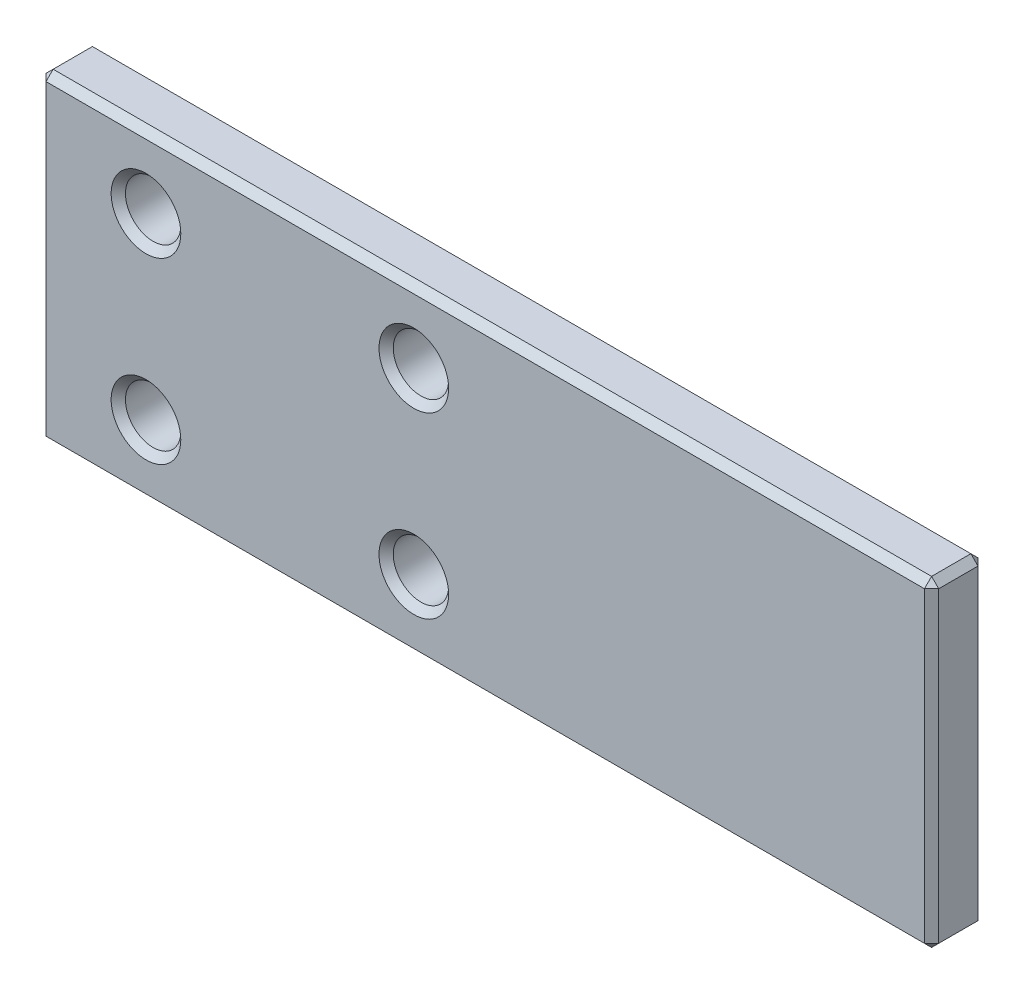
ISO-10303-21;
HEADER;
FILE_DESCRIPTION(('STEP AP214'),'2;1');
FILE_NAME('part.step','',(''),(''),'','','');
FILE_SCHEMA(('AUTOMOTIVE_DESIGN { 1 0 10303 214 1 1 1 1 }'));
ENDSEC;
DATA;
#1=APPLICATION_CONTEXT('core data for automotive mechanical design processes');
#2=APPLICATION_PROTOCOL_DEFINITION('international standard','automotive_design',2000,#1);
#3=PRODUCT_CONTEXT('',#1,'mechanical');
#4=PRODUCT('Part','Part','',(#3));
#5=PRODUCT_RELATED_PRODUCT_CATEGORY('part','',(#4));
#6=PRODUCT_DEFINITION_FORMATION('','',#4);
#7=PRODUCT_DEFINITION_CONTEXT('part definition',#1,'design');
#8=PRODUCT_DEFINITION('design','',#6,#7);
#9=PRODUCT_DEFINITION_SHAPE('','',#8);
#10=(LENGTH_UNIT() NAMED_UNIT(*) SI_UNIT(.MILLI.,.METRE.));
#11=(NAMED_UNIT(*) PLANE_ANGLE_UNIT() SI_UNIT($,.RADIAN.));
#12=(NAMED_UNIT(*) SI_UNIT($,.STERADIAN.) SOLID_ANGLE_UNIT());
#13=UNCERTAINTY_MEASURE_WITH_UNIT(LENGTH_MEASURE(1.E-05),#10,'distance_accuracy_value','');
#14=(GEOMETRIC_REPRESENTATION_CONTEXT(3) GLOBAL_UNCERTAINTY_ASSIGNED_CONTEXT((#13)) GLOBAL_UNIT_ASSIGNED_CONTEXT((#10,
#11,#12)) REPRESENTATION_CONTEXT('',''));
#15=CARTESIAN_POINT('',(0.,0.,0.));
#16=DIRECTION('',(0.,0.,1.));
#17=DIRECTION('',(1.,0.,0.));
#18=AXIS2_PLACEMENT_3D('',#15,#16,#17);
#19=CARTESIAN_POINT('',(-15.3774556196048,8.44067796610169,3.));
#20=DIRECTION('',(1.,0.,0.));
#21=DIRECTION('',(0.,0.,-1.));
#22=AXIS2_PLACEMENT_3D('',#19,#20,#21);
#23=PLANE('',#22);
#24=DIRECTION('',(0.,1.,0.));
#25=VECTOR('',#24,1.);
#26=CARTESIAN_POINT('',(-15.3774556196048,8.44067796610169,2.6));
#27=LINE('',#26,#25);
#28=CARTESIAN_POINT('',(-15.3774556196048,-9.1593220338983,2.6));
#29=VERTEX_POINT('',#28);
#30=CARTESIAN_POINT('',(-15.3774556196048,8.0406779661017,2.6));
#31=VERTEX_POINT('',#30);
#32=EDGE_CURVE('E153',#29,#31,#27,.T.);
#33=ORIENTED_EDGE('',*,*,#32,.T.);
#34=DIRECTION('',(0.,0.,-1.));
#35=VECTOR('',#34,1.);
#36=CARTESIAN_POINT('',(-15.3774556196048,8.0406779661017,3.));
#37=LINE('',#36,#35);
#38=CARTESIAN_POINT('',(-15.3774556196048,8.0406779661017,0.399999999999998));
#39=VERTEX_POINT('',#38);
#40=EDGE_CURVE('E235',#31,#39,#37,.T.);
#41=ORIENTED_EDGE('',*,*,#40,.T.);
#42=DIRECTION('',(0.,-1.,0.));
#43=VECTOR('',#42,1.);
#44=CARTESIAN_POINT('',(-15.3774556196048,8.44067796610169,0.399999999999998));
#45=LINE('',#44,#43);
#46=CARTESIAN_POINT('',(-15.3774556196048,-9.1593220338983,0.399999999999998));
#47=VERTEX_POINT('',#46);
#48=EDGE_CURVE('E232',#39,#47,#45,.T.);
#49=ORIENTED_EDGE('',*,*,#48,.T.);
#50=DIRECTION('',(0.,0.,1.));
#51=VECTOR('',#50,1.);
#52=CARTESIAN_POINT('',(-15.3774556196048,-9.1593220338983,3.));
#53=LINE('',#52,#51);
#54=EDGE_CURVE('E229',#47,#29,#53,.T.);
#55=ORIENTED_EDGE('',*,*,#54,.T.);
#56=EDGE_LOOP('',(#33,#41,#49,#55));
#57=FACE_BOUND('',#56,.T.);
#58=ADVANCED_FACE('F39',(#57),#23,.F.);
#59=CARTESIAN_POINT('',(-15.3774556196048,-9.5593220338983,3.));
#60=DIRECTION('',(0.,1.,0.));
#61=DIRECTION('',(-1.,0.,0.));
#62=AXIS2_PLACEMENT_3D('',#59,#60,#61);
#63=PLANE('',#62);
#64=DIRECTION('',(0.,0.,-1.));
#65=VECTOR('',#64,1.);
#66=CARTESIAN_POINT('',(-14.9774556196048,-9.5593220338983,3.));
#67=LINE('',#66,#65);
#68=CARTESIAN_POINT('',(-14.9774556196048,-9.5593220338983,2.6));
#69=VERTEX_POINT('',#68);
#70=CARTESIAN_POINT('',(-14.9774556196048,-9.5593220338983,0.399999999999998));
#71=VERTEX_POINT('',#70);
#72=EDGE_CURVE('E237',#69,#71,#67,.T.);
#73=ORIENTED_EDGE('',*,*,#72,.T.);
#74=DIRECTION('',(1.,0.,0.));
#75=VECTOR('',#74,1.);
#76=CARTESIAN_POINT('',(-15.3774556196048,-9.5593220338983,0.399999999999998));
#77=LINE('',#76,#75);
#78=CARTESIAN_POINT('',(34.2225443803952,-9.5593220338983,0.399999999999998));
#79=VERTEX_POINT('',#78);
#80=EDGE_CURVE('E243',#71,#79,#77,.T.);
#81=ORIENTED_EDGE('',*,*,#80,.T.);
#82=DIRECTION('',(0.,0.,1.));
#83=VECTOR('',#82,1.);
#84=CARTESIAN_POINT('',(34.2225443803952,-9.5593220338983,3.));
#85=LINE('',#84,#83);
#86=CARTESIAN_POINT('',(34.2225443803952,-9.5593220338983,2.6));
#87=VERTEX_POINT('',#86);
#88=EDGE_CURVE('E241',#79,#87,#85,.T.);
#89=ORIENTED_EDGE('',*,*,#88,.T.);
#90=DIRECTION('',(-1.,0.,0.));
#91=VECTOR('',#90,1.);
#92=CARTESIAN_POINT('',(-15.3774556196048,-9.5593220338983,2.6));
#93=LINE('',#92,#91);
#94=EDGE_CURVE('E239',#87,#69,#93,.T.);
#95=ORIENTED_EDGE('',*,*,#94,.T.);
#96=EDGE_LOOP('',(#73,#81,#89,#95));
#97=FACE_BOUND('',#96,.T.);
#98=ADVANCED_FACE('F343',(#97),#63,.F.);
#99=CARTESIAN_POINT('',(34.6225443803952,8.44067796610169,3.));
#100=DIRECTION('',(-1.,0.,0.));
#101=DIRECTION('',(0.,0.,1.));
#102=AXIS2_PLACEMENT_3D('',#99,#100,#101);
#103=PLANE('',#102);
#104=DIRECTION('',(0.,0.,-1.));
#105=VECTOR('',#104,1.);
#106=CARTESIAN_POINT('',(34.6225443803952,-9.1593220338983,3.));
#107=LINE('',#106,#105);
#108=CARTESIAN_POINT('',(34.6225443803952,-9.1593220338983,2.6));
#109=VERTEX_POINT('',#108);
#110=CARTESIAN_POINT('',(34.6225443803952,-9.1593220338983,0.399999999999998));
#111=VERTEX_POINT('',#110);
#112=EDGE_CURVE('E246',#109,#111,#107,.T.);
#113=ORIENTED_EDGE('',*,*,#112,.T.);
#114=DIRECTION('',(0.,1.,0.));
#115=VECTOR('',#114,1.);
#116=CARTESIAN_POINT('',(34.6225443803952,8.44067796610169,0.399999999999998));
#117=LINE('',#116,#115);
#118=CARTESIAN_POINT('',(34.6225443803952,8.0406779661017,0.399999999999998));
#119=VERTEX_POINT('',#118);
#120=EDGE_CURVE('E252',#111,#119,#117,.T.);
#121=ORIENTED_EDGE('',*,*,#120,.T.);
#122=DIRECTION('',(0.,0.,1.));
#123=VECTOR('',#122,1.);
#124=CARTESIAN_POINT('',(34.6225443803952,8.0406779661017,3.));
#125=LINE('',#124,#123);
#126=CARTESIAN_POINT('',(34.6225443803952,8.0406779661017,2.6));
#127=VERTEX_POINT('',#126);
#128=EDGE_CURVE('E250',#119,#127,#125,.T.);
#129=ORIENTED_EDGE('',*,*,#128,.T.);
#130=DIRECTION('',(0.,-1.,0.));
#131=VECTOR('',#130,1.);
#132=CARTESIAN_POINT('',(34.6225443803952,-9.5593220338983,2.6));
#133=LINE('',#132,#131);
#134=EDGE_CURVE('E248',#127,#109,#133,.T.);
#135=ORIENTED_EDGE('',*,*,#134,.T.);
#136=EDGE_LOOP('',(#113,#121,#129,#135));
#137=FACE_BOUND('',#136,.T.);
#138=ADVANCED_FACE('F372',(#137),#103,.F.);
#139=CARTESIAN_POINT('',(-15.3774556196048,8.44067796610169,3.));
#140=DIRECTION('',(0.,-1.,0.));
#141=DIRECTION('',(0.,0.,-1.));
#142=AXIS2_PLACEMENT_3D('',#139,#140,#141);
#143=PLANE('',#142);
#144=DIRECTION('',(0.,0.,-1.));
#145=VECTOR('',#144,1.);
#146=CARTESIAN_POINT('',(34.2225443803952,8.44067796610169,3.));
#147=LINE('',#146,#145);
#148=CARTESIAN_POINT('',(34.2225443803952,8.44067796610169,2.6));
#149=VERTEX_POINT('',#148);
#150=CARTESIAN_POINT('',(34.2225443803952,8.44067796610169,0.399999999999998));
#151=VERTEX_POINT('',#150);
#152=EDGE_CURVE('E255',#149,#151,#147,.T.);
#153=ORIENTED_EDGE('',*,*,#152,.T.);
#154=DIRECTION('',(-1.,0.,0.));
#155=VECTOR('',#154,1.);
#156=CARTESIAN_POINT('',(-15.3774556196048,8.44067796610169,0.399999999999998));
#157=LINE('',#156,#155);
#158=CARTESIAN_POINT('',(-14.9774556196048,8.44067796610169,0.399999999999998));
#159=VERTEX_POINT('',#158);
#160=EDGE_CURVE('E11',#151,#159,#157,.T.);
#161=ORIENTED_EDGE('',*,*,#160,.T.);
#162=DIRECTION('',(0.,0.,1.));
#163=VECTOR('',#162,1.);
#164=CARTESIAN_POINT('',(-14.9774556196048,8.44067796610169,3.));
#165=LINE('',#164,#163);
#166=CARTESIAN_POINT('',(-14.9774556196048,8.44067796610169,2.6));
#167=VERTEX_POINT('',#166);
#168=EDGE_CURVE('E49',#159,#167,#165,.T.);
#169=ORIENTED_EDGE('',*,*,#168,.T.);
#170=DIRECTION('',(1.,0.,0.));
#171=VECTOR('',#170,1.);
#172=CARTESIAN_POINT('',(34.6225443803952,8.44067796610169,2.6));
#173=LINE('',#172,#171);
#174=EDGE_CURVE('E257',#167,#149,#173,.T.);
#175=ORIENTED_EDGE('',*,*,#174,.T.);
#176=EDGE_LOOP('',(#153,#161,#169,#175));
#177=FACE_BOUND('',#176,.T.);
#178=ADVANCED_FACE('F325',(#177),#143,.F.);
#179=CARTESIAN_POINT('',(0.,0.,3.));
#180=DIRECTION('',(0.,0.,1.));
#181=DIRECTION('',(1.,0.,0.));
#182=AXIS2_PLACEMENT_3D('',#179,#180,#181);
#183=PLANE('',#182);
#184=CARTESIAN_POINT('',(-9.37745561960491,-5.55932203389831,3.));
#185=DIRECTION('',(0.,0.,1.));
#186=DIRECTION('',(1.,0.,0.));
#187=AXIS2_PLACEMENT_3D('',#184,#185,#186);
#188=CIRCLE('',#187,1.95000000000001);
#189=CARTESIAN_POINT('',(-7.42745561960489,-5.55932203389831,3.));
#190=VERTEX_POINT('',#189);
#191=EDGE_CURVE('E181',#190,#190,#188,.F.);
#192=ORIENTED_EDGE('',*,*,#191,.T.);
#193=EDGE_LOOP('',(#192));
#194=FACE_BOUND('',#193,.T.);
#195=CARTESIAN_POINT('',(5.62254438039509,-5.55932203389841,3.));
#196=DIRECTION('',(0.,0.,1.));
#197=DIRECTION('',(1.,0.,0.));
#198=AXIS2_PLACEMENT_3D('',#195,#196,#197);
#199=CIRCLE('',#198,1.95000000000001);
#200=CARTESIAN_POINT('',(7.57254438039511,-5.55932203389841,3.));
#201=VERTEX_POINT('',#200);
#202=EDGE_CURVE('E178',#201,#201,#199,.F.);
#203=ORIENTED_EDGE('',*,*,#202,.T.);
#204=EDGE_LOOP('',(#203));
#205=FACE_BOUND('',#204,.T.);
#206=CARTESIAN_POINT('',(5.6225443803952,4.44067796610159,3.));
#207=DIRECTION('',(0.,0.,1.));
#208=DIRECTION('',(1.,0.,0.));
#209=AXIS2_PLACEMENT_3D('',#206,#207,#208);
#210=CIRCLE('',#209,1.95000000000001);
#211=CARTESIAN_POINT('',(7.57254438039521,4.44067796610159,3.));
#212=VERTEX_POINT('',#211);
#213=EDGE_CURVE('E171',#212,#212,#210,.F.);
#214=ORIENTED_EDGE('',*,*,#213,.T.);
#215=EDGE_LOOP('',(#214));
#216=FACE_BOUND('',#215,.T.);
#217=CARTESIAN_POINT('',(-9.3774556196048,4.44067796610169,3.));
#218=DIRECTION('',(0.,0.,1.));
#219=DIRECTION('',(1.,0.,0.));
#220=AXIS2_PLACEMENT_3D('',#217,#218,#219);
#221=CIRCLE('',#220,1.95000000000001);
#222=CARTESIAN_POINT('',(-7.42745561960479,4.44067796610169,3.));
#223=VERTEX_POINT('',#222);
#224=EDGE_CURVE('E168',#223,#223,#221,.F.);
#225=ORIENTED_EDGE('',*,*,#224,.T.);
#226=EDGE_LOOP('',(#225));
#227=FACE_BOUND('',#226,.T.);
#228=DIRECTION('',(-1.,0.,0.));
#229=VECTOR('',#228,1.);
#230=CARTESIAN_POINT('',(-15.3774556196048,8.0406779661017,3.));
#231=LINE('',#230,#229);
#232=CARTESIAN_POINT('',(34.2225443803952,8.0406779661017,3.));
#233=VERTEX_POINT('',#232);
#234=CARTESIAN_POINT('',(-14.9774556196048,8.0406779661017,3.));
#235=VERTEX_POINT('',#234);
#236=EDGE_CURVE('E167',#233,#235,#231,.T.);
#237=ORIENTED_EDGE('',*,*,#236,.T.);
#238=DIRECTION('',(0.,-1.,0.));
#239=VECTOR('',#238,1.);
#240=CARTESIAN_POINT('',(-14.9774556196048,-9.5593220338983,3.));
#241=LINE('',#240,#239);
#242=CARTESIAN_POINT('',(-14.9774556196048,-9.15932203389831,3.));
#243=VERTEX_POINT('',#242);
#244=EDGE_CURVE('E151',#235,#243,#241,.T.);
#245=ORIENTED_EDGE('',*,*,#244,.T.);
#246=DIRECTION('',(1.,0.,0.));
#247=VECTOR('',#246,1.);
#248=CARTESIAN_POINT('',(34.6225443803952,-9.15932203389831,3.));
#249=LINE('',#248,#247);
#250=CARTESIAN_POINT('',(34.2225443803952,-9.15932203389831,3.));
#251=VERTEX_POINT('',#250);
#252=EDGE_CURVE('E157',#243,#251,#249,.T.);
#253=ORIENTED_EDGE('',*,*,#252,.T.);
#254=DIRECTION('',(0.,1.,0.));
#255=VECTOR('',#254,1.);
#256=CARTESIAN_POINT('',(34.2225443803952,8.44067796610169,3.));
#257=LINE('',#256,#255);
#258=EDGE_CURVE('E163',#251,#233,#257,.T.);
#259=ORIENTED_EDGE('',*,*,#258,.T.);
#260=EDGE_LOOP('',(#237,#245,#253,#259));
#261=FACE_BOUND('',#260,.T.);
#262=ADVANCED_FACE('F165',(#194,#205,#216,#227,#261),#183,.T.);
#263=CARTESIAN_POINT('',(0.,0.,0.));
#264=DIRECTION('',(0.,0.,1.));
#265=DIRECTION('',(1.,0.,0.));
#266=AXIS2_PLACEMENT_3D('',#263,#264,#265);
#267=PLANE('',#266);
#268=CARTESIAN_POINT('',(-9.37745561960491,-5.55932203389831,0.));
#269=DIRECTION('',(0.,0.,1.));
#270=DIRECTION('',(1.,0.,0.));
#271=AXIS2_PLACEMENT_3D('',#268,#269,#270);
#272=CIRCLE('',#271,1.94999999999999);
#273=CARTESIAN_POINT('',(-7.42745561960492,-5.55932203389831,0.));
#274=VERTEX_POINT('',#273);
#275=EDGE_CURVE('E208',#274,#274,#272,.T.);
#276=ORIENTED_EDGE('',*,*,#275,.T.);
#277=EDGE_LOOP('',(#276));
#278=FACE_BOUND('',#277,.T.);
#279=CARTESIAN_POINT('',(5.62254438039509,-5.55932203389841,0.));
#280=DIRECTION('',(0.,0.,1.));
#281=DIRECTION('',(1.,0.,0.));
#282=AXIS2_PLACEMENT_3D('',#279,#280,#281);
#283=CIRCLE('',#282,1.94999999999999);
#284=CARTESIAN_POINT('',(7.57254438039508,-5.55932203389841,0.));
#285=VERTEX_POINT('',#284);
#286=EDGE_CURVE('E205',#285,#285,#283,.T.);
#287=ORIENTED_EDGE('',*,*,#286,.T.);
#288=EDGE_LOOP('',(#287));
#289=FACE_BOUND('',#288,.T.);
#290=CARTESIAN_POINT('',(5.6225443803952,4.44067796610159,0.));
#291=DIRECTION('',(0.,0.,1.));
#292=DIRECTION('',(1.,0.,0.));
#293=AXIS2_PLACEMENT_3D('',#290,#291,#292);
#294=CIRCLE('',#293,1.94999999999999);
#295=CARTESIAN_POINT('',(7.57254438039518,4.44067796610159,0.));
#296=VERTEX_POINT('',#295);
#297=EDGE_CURVE('E202',#296,#296,#294,.T.);
#298=ORIENTED_EDGE('',*,*,#297,.T.);
#299=EDGE_LOOP('',(#298));
#300=FACE_BOUND('',#299,.T.);
#301=CARTESIAN_POINT('',(-9.3774556196048,4.44067796610169,0.));
#302=DIRECTION('',(0.,0.,1.));
#303=DIRECTION('',(1.,0.,0.));
#304=AXIS2_PLACEMENT_3D('',#301,#302,#303);
#305=CIRCLE('',#304,1.94999999999999);
#306=CARTESIAN_POINT('',(-7.42745561960482,4.44067796610169,0.));
#307=VERTEX_POINT('',#306);
#308=EDGE_CURVE('E199',#307,#307,#305,.T.);
#309=ORIENTED_EDGE('',*,*,#308,.T.);
#310=EDGE_LOOP('',(#309));
#311=FACE_BOUND('',#310,.T.);
#312=DIRECTION('',(-1.,0.,0.));
#313=VECTOR('',#312,1.);
#314=CARTESIAN_POINT('',(0.,-9.15932203389831,0.));
#315=LINE('',#314,#313);
#316=CARTESIAN_POINT('',(34.2225443803952,-9.15932203389831,0.));
#317=VERTEX_POINT('',#316);
#318=CARTESIAN_POINT('',(-14.9774556196048,-9.15932203389831,0.));
#319=VERTEX_POINT('',#318);
#320=EDGE_CURVE('E194',#317,#319,#315,.T.);
#321=ORIENTED_EDGE('',*,*,#320,.T.);
#322=DIRECTION('',(0.,1.,0.));
#323=VECTOR('',#322,1.);
#324=CARTESIAN_POINT('',(-14.9774556196048,0.,0.));
#325=LINE('',#324,#323);
#326=CARTESIAN_POINT('',(-14.9774556196048,8.0406779661017,0.));
#327=VERTEX_POINT('',#326);
#328=EDGE_CURVE('E196',#319,#327,#325,.T.);
#329=ORIENTED_EDGE('',*,*,#328,.T.);
#330=DIRECTION('',(1.,0.,0.));
#331=VECTOR('',#330,1.);
#332=CARTESIAN_POINT('',(0.,8.0406779661017,0.));
#333=LINE('',#332,#331);
#334=CARTESIAN_POINT('',(34.2225443803952,8.0406779661017,0.));
#335=VERTEX_POINT('',#334);
#336=EDGE_CURVE('E190',#327,#335,#333,.T.);
#337=ORIENTED_EDGE('',*,*,#336,.T.);
#338=DIRECTION('',(0.,-1.,0.));
#339=VECTOR('',#338,1.);
#340=CARTESIAN_POINT('',(34.2225443803952,0.,0.));
#341=LINE('',#340,#339);
#342=EDGE_CURVE('E192',#335,#317,#341,.T.);
#343=ORIENTED_EDGE('',*,*,#342,.T.);
#344=EDGE_LOOP('',(#321,#329,#337,#343));
#345=FACE_BOUND('',#344,.T.);
#346=ADVANCED_FACE('F786',(#278,#289,#300,#311,#345),#267,.F.);
#347=CARTESIAN_POINT('',(-9.3774556196048,4.44067796610169,3.));
#348=DIRECTION('',(0.,0.,-1.));
#349=DIRECTION('',(-1.,0.,0.));
#350=AXIS2_PLACEMENT_3D('',#347,#348,#349);
#351=CYLINDRICAL_SURFACE('',#350,1.55);
#352=CARTESIAN_POINT('',(-9.3774556196048,4.44067796610169,0.399999999999985));
#353=DIRECTION('',(0.,0.,1.));
#354=DIRECTION('',(1.,0.,0.));
#355=AXIS2_PLACEMENT_3D('',#352,#353,#354);
#356=CIRCLE('',#355,1.55);
#357=CARTESIAN_POINT('',(-7.8274556196048,4.44067796610169,0.399999999999985));
#358=VERTEX_POINT('',#357);
#359=EDGE_CURVE('E226',#358,#358,#356,.F.);
#360=ORIENTED_EDGE('',*,*,#359,.T.);
#361=EDGE_LOOP('',(#360));
#362=FACE_BOUND('',#361,.T.);
#363=CARTESIAN_POINT('',(-9.3774556196048,4.44067796610169,2.59999999999999));
#364=DIRECTION('',(0.,0.,1.));
#365=DIRECTION('',(1.,0.,0.));
#366=AXIS2_PLACEMENT_3D('',#363,#364,#365);
#367=CIRCLE('',#366,1.55);
#368=CARTESIAN_POINT('',(-7.8274556196048,4.44067796610169,2.59999999999999));
#369=VERTEX_POINT('',#368);
#370=EDGE_CURVE('E223',#369,#369,#367,.T.);
#371=ORIENTED_EDGE('',*,*,#370,.T.);
#372=EDGE_LOOP('',(#371));
#373=FACE_BOUND('',#372,.T.);
#374=ADVANCED_FACE('F775',(#362,#373),#351,.F.);
#375=CARTESIAN_POINT('',(5.6225443803952,4.44067796610159,3.));
#376=DIRECTION('',(0.,0.,-1.));
#377=DIRECTION('',(-1.,0.,0.));
#378=AXIS2_PLACEMENT_3D('',#375,#376,#377);
#379=CYLINDRICAL_SURFACE('',#378,1.55);
#380=CARTESIAN_POINT('',(5.6225443803952,4.44067796610159,2.59999999999999));
#381=DIRECTION('',(0.,0.,1.));
#382=DIRECTION('',(1.,0.,0.));
#383=AXIS2_PLACEMENT_3D('',#380,#381,#382);
#384=CIRCLE('',#383,1.55);
#385=CARTESIAN_POINT('',(7.1725443803952,4.44067796610159,2.59999999999999));
#386=VERTEX_POINT('',#385);
#387=EDGE_CURVE('E220',#386,#386,#384,.T.);
#388=ORIENTED_EDGE('',*,*,#387,.T.);
#389=EDGE_LOOP('',(#388));
#390=FACE_BOUND('',#389,.T.);
#391=CARTESIAN_POINT('',(5.6225443803952,4.44067796610159,0.399999999999985));
#392=DIRECTION('',(0.,0.,1.));
#393=DIRECTION('',(1.,0.,0.));
#394=AXIS2_PLACEMENT_3D('',#391,#392,#393);
#395=CIRCLE('',#394,1.55);
#396=CARTESIAN_POINT('',(7.1725443803952,4.44067796610159,0.399999999999985));
#397=VERTEX_POINT('',#396);
#398=EDGE_CURVE('E217',#397,#397,#395,.F.);
#399=ORIENTED_EDGE('',*,*,#398,.T.);
#400=EDGE_LOOP('',(#399));
#401=FACE_BOUND('',#400,.T.);
#402=ADVANCED_FACE('F764',(#390,#401),#379,.F.);
#403=CARTESIAN_POINT('',(5.62254438039509,-5.55932203389841,3.));
#404=DIRECTION('',(0.,0.,-1.));
#405=DIRECTION('',(-1.,0.,0.));
#406=AXIS2_PLACEMENT_3D('',#403,#404,#405);
#407=CYLINDRICAL_SURFACE('',#406,1.55);
#408=CARTESIAN_POINT('',(5.62254438039509,-5.55932203389841,2.59999999999999));
#409=DIRECTION('',(0.,0.,1.));
#410=DIRECTION('',(1.,0.,0.));
#411=AXIS2_PLACEMENT_3D('',#408,#409,#410);
#412=CIRCLE('',#411,1.55);
#413=CARTESIAN_POINT('',(7.17254438039509,-5.55932203389841,2.59999999999999));
#414=VERTEX_POINT('',#413);
#415=EDGE_CURVE('E214',#414,#414,#412,.T.);
#416=ORIENTED_EDGE('',*,*,#415,.T.);
#417=EDGE_LOOP('',(#416));
#418=FACE_BOUND('',#417,.T.);
#419=CARTESIAN_POINT('',(5.62254438039509,-5.55932203389841,0.399999999999985));
#420=DIRECTION('',(0.,0.,1.));
#421=DIRECTION('',(1.,0.,0.));
#422=AXIS2_PLACEMENT_3D('',#419,#420,#421);
#423=CIRCLE('',#422,1.55);
#424=CARTESIAN_POINT('',(7.17254438039509,-5.55932203389841,0.399999999999985));
#425=VERTEX_POINT('',#424);
#426=EDGE_CURVE('E211',#425,#425,#423,.F.);
#427=ORIENTED_EDGE('',*,*,#426,.T.);
#428=EDGE_LOOP('',(#427));
#429=FACE_BOUND('',#428,.T.);
#430=ADVANCED_FACE('F753',(#418,#429),#407,.F.);
#431=CARTESIAN_POINT('',(-9.37745561960491,-5.55932203389831,3.));
#432=DIRECTION('',(0.,0.,-1.));
#433=DIRECTION('',(-1.,0.,0.));
#434=AXIS2_PLACEMENT_3D('',#431,#432,#433);
#435=CYLINDRICAL_SURFACE('',#434,1.55);
#436=CARTESIAN_POINT('',(-9.37745561960491,-5.55932203389831,2.59999999999999));
#437=DIRECTION('',(0.,0.,1.));
#438=DIRECTION('',(1.,0.,0.));
#439=AXIS2_PLACEMENT_3D('',#436,#437,#438);
#440=CIRCLE('',#439,1.55);
#441=CARTESIAN_POINT('',(-7.82745561960491,-5.55932203389831,2.59999999999999));
#442=VERTEX_POINT('',#441);
#443=EDGE_CURVE('E187',#442,#442,#440,.T.);
#444=ORIENTED_EDGE('',*,*,#443,.T.);
#445=EDGE_LOOP('',(#444));
#446=FACE_BOUND('',#445,.T.);
#447=CARTESIAN_POINT('',(-9.37745561960491,-5.55932203389831,0.399999999999985));
#448=DIRECTION('',(0.,0.,1.));
#449=DIRECTION('',(1.,0.,0.));
#450=AXIS2_PLACEMENT_3D('',#447,#448,#449);
#451=CIRCLE('',#450,1.55);
#452=CARTESIAN_POINT('',(-7.82745561960491,-5.55932203389831,0.399999999999985));
#453=VERTEX_POINT('',#452);
#454=EDGE_CURVE('E184',#453,#453,#451,.F.);
#455=ORIENTED_EDGE('',*,*,#454,.T.);
#456=EDGE_LOOP('',(#455));
#457=FACE_BOUND('',#456,.T.);
#458=ADVANCED_FACE('F384',(#446,#457),#435,.F.);
#459=CARTESIAN_POINT('',(-9.37745561960491,-5.55932203389831,3.));
#460=DIRECTION('',(0.,0.,1.));
#461=DIRECTION('',(1.,0.,0.));
#462=AXIS2_PLACEMENT_3D('',#459,#460,#461);
#463=CONICAL_SURFACE('',#462,1.95000000000001,0.78539816339745);
#464=ORIENTED_EDGE('',*,*,#443,.F.);
#465=EDGE_LOOP('',(#464));
#466=FACE_BOUND('',#465,.T.);
#467=ORIENTED_EDGE('',*,*,#191,.F.);
#468=EDGE_LOOP('',(#467));
#469=FACE_BOUND('',#468,.T.);
#470=ADVANCED_FACE('F377',(#466,#469),#463,.F.);
#471=CARTESIAN_POINT('',(-9.37745561960491,-5.55932203389831,0.399999999999985));
#472=DIRECTION('',(0.,0.,-1.));
#473=DIRECTION('',(-1.,0.,0.));
#474=AXIS2_PLACEMENT_3D('',#471,#472,#473);
#475=CONICAL_SURFACE('',#474,1.55,0.78539816339745);
#476=ORIENTED_EDGE('',*,*,#275,.F.);
#477=EDGE_LOOP('',(#476));
#478=FACE_BOUND('',#477,.T.);
#479=ORIENTED_EDGE('',*,*,#454,.F.);
#480=EDGE_LOOP('',(#479));
#481=FACE_BOUND('',#480,.T.);
#482=ADVANCED_FACE('F383',(#478,#481),#475,.F.);
#483=CARTESIAN_POINT('',(5.62254438039509,-5.55932203389841,3.));
#484=DIRECTION('',(0.,0.,1.));
#485=DIRECTION('',(1.,0.,0.));
#486=AXIS2_PLACEMENT_3D('',#483,#484,#485);
#487=CONICAL_SURFACE('',#486,1.95000000000001,0.78539816339745);
#488=ORIENTED_EDGE('',*,*,#415,.F.);
#489=EDGE_LOOP('',(#488));
#490=FACE_BOUND('',#489,.T.);
#491=ORIENTED_EDGE('',*,*,#202,.F.);
#492=EDGE_LOOP('',(#491));
#493=FACE_BOUND('',#492,.T.);
#494=ADVANCED_FACE('F391',(#490,#493),#487,.F.);
#495=CARTESIAN_POINT('',(5.62254438039509,-5.55932203389841,0.399999999999985));
#496=DIRECTION('',(0.,0.,-1.));
#497=DIRECTION('',(-1.,0.,0.));
#498=AXIS2_PLACEMENT_3D('',#495,#496,#497);
#499=CONICAL_SURFACE('',#498,1.55,0.78539816339745);
#500=ORIENTED_EDGE('',*,*,#286,.F.);
#501=EDGE_LOOP('',(#500));
#502=FACE_BOUND('',#501,.T.);
#503=ORIENTED_EDGE('',*,*,#426,.F.);
#504=EDGE_LOOP('',(#503));
#505=FACE_BOUND('',#504,.T.);
#506=ADVANCED_FACE('F398',(#502,#505),#499,.F.);
#507=CARTESIAN_POINT('',(5.6225443803952,4.44067796610159,3.));
#508=DIRECTION('',(0.,0.,1.));
#509=DIRECTION('',(1.,0.,0.));
#510=AXIS2_PLACEMENT_3D('',#507,#508,#509);
#511=CONICAL_SURFACE('',#510,1.95000000000001,0.78539816339745);
#512=ORIENTED_EDGE('',*,*,#387,.F.);
#513=EDGE_LOOP('',(#512));
#514=FACE_BOUND('',#513,.T.);
#515=ORIENTED_EDGE('',*,*,#213,.F.);
#516=EDGE_LOOP('',(#515));
#517=FACE_BOUND('',#516,.T.);
#518=ADVANCED_FACE('F405',(#514,#517),#511,.F.);
#519=CARTESIAN_POINT('',(5.6225443803952,4.44067796610159,0.399999999999985));
#520=DIRECTION('',(0.,0.,-1.));
#521=DIRECTION('',(-1.,0.,0.));
#522=AXIS2_PLACEMENT_3D('',#519,#520,#521);
#523=CONICAL_SURFACE('',#522,1.55,0.78539816339745);
#524=ORIENTED_EDGE('',*,*,#297,.F.);
#525=EDGE_LOOP('',(#524));
#526=FACE_BOUND('',#525,.T.);
#527=ORIENTED_EDGE('',*,*,#398,.F.);
#528=EDGE_LOOP('',(#527));
#529=FACE_BOUND('',#528,.T.);
#530=ADVANCED_FACE('F412',(#526,#529),#523,.F.);
#531=CARTESIAN_POINT('',(-9.3774556196048,4.44067796610169,0.399999999999985));
#532=DIRECTION('',(0.,0.,-1.));
#533=DIRECTION('',(-1.,0.,0.));
#534=AXIS2_PLACEMENT_3D('',#531,#532,#533);
#535=CONICAL_SURFACE('',#534,1.55,0.78539816339745);
#536=ORIENTED_EDGE('',*,*,#308,.F.);
#537=EDGE_LOOP('',(#536));
#538=FACE_BOUND('',#537,.T.);
#539=ORIENTED_EDGE('',*,*,#359,.F.);
#540=EDGE_LOOP('',(#539));
#541=FACE_BOUND('',#540,.T.);
#542=ADVANCED_FACE('F419',(#538,#541),#535,.F.);
#543=CARTESIAN_POINT('',(-9.3774556196048,4.44067796610169,3.));
#544=DIRECTION('',(0.,0.,1.));
#545=DIRECTION('',(1.,0.,0.));
#546=AXIS2_PLACEMENT_3D('',#543,#544,#545);
#547=CONICAL_SURFACE('',#546,1.95000000000001,0.78539816339745);
#548=ORIENTED_EDGE('',*,*,#370,.F.);
#549=EDGE_LOOP('',(#548));
#550=FACE_BOUND('',#549,.T.);
#551=ORIENTED_EDGE('',*,*,#224,.F.);
#552=EDGE_LOOP('',(#551));
#553=FACE_BOUND('',#552,.T.);
#554=ADVANCED_FACE('F426',(#550,#553),#547,.F.);
#555=CARTESIAN_POINT('',(34.2225443803952,0.,3.));
#556=DIRECTION('',(0.707106781186548,0.,0.707106781186548));
#557=DIRECTION('',(0.,-1.,0.));
#558=AXIS2_PLACEMENT_3D('',#555,#556,#557);
#559=PLANE('',#558);
#560=DIRECTION('',(0.707106781186547,0.,-0.707106781186547));
#561=VECTOR('',#560,1.);
#562=CARTESIAN_POINT('',(34.4225443803952,8.0406779661017,2.8));
#563=LINE('',#562,#561);
#564=EDGE_CURVE('E44',#233,#127,#563,.T.);
#565=ORIENTED_EDGE('',*,*,#564,.F.);
#566=ORIENTED_EDGE('',*,*,#258,.F.);
#567=DIRECTION('',(-0.707106781186548,0.,0.707106781186548));
#568=VECTOR('',#567,1.);
#569=CARTESIAN_POINT('',(34.6225443803952,-9.1593220338983,2.6));
#570=LINE('',#569,#568);
#571=EDGE_CURVE('E306',#109,#251,#570,.T.);
#572=ORIENTED_EDGE('',*,*,#571,.F.);
#573=ORIENTED_EDGE('',*,*,#134,.F.);
#574=EDGE_LOOP('',(#565,#566,#572,#573));
#575=FACE_BOUND('',#574,.T.);
#576=ADVANCED_FACE('F42',(#575),#559,.T.);
#577=CARTESIAN_POINT('',(34.2225443803952,8.44067796610169,2.6));
#578=DIRECTION('',(0.577350269189626,0.577350269189626,0.577350269189626));
#579=DIRECTION('',(0.707106781186548,0.,-0.707106781186548));
#580=AXIS2_PLACEMENT_3D('',#577,#578,#579);
#581=PLANE('',#580);
#582=DIRECTION('',(0.,-0.707106781186547,0.707106781186547));
#583=VECTOR('',#582,1.);
#584=CARTESIAN_POINT('',(34.2225443803952,8.44067796610169,2.6));
#585=LINE('',#584,#583);
#586=EDGE_CURVE('E301',#233,#149,#585,.F.);
#587=ORIENTED_EDGE('',*,*,#586,.F.);
#588=ORIENTED_EDGE('',*,*,#564,.T.);
#589=DIRECTION('',(0.707106781186547,-0.707106781186547,0.));
#590=VECTOR('',#589,1.);
#591=CARTESIAN_POINT('',(34.2225443803952,8.44067796610169,2.6));
#592=LINE('',#591,#590);
#593=EDGE_CURVE('E304',#149,#127,#592,.T.);
#594=ORIENTED_EDGE('',*,*,#593,.F.);
#595=EDGE_LOOP('',(#587,#588,#594));
#596=FACE_BOUND('',#595,.T.);
#597=ADVANCED_FACE('F316',(#596),#581,.T.);
#598=CARTESIAN_POINT('',(34.6225443803952,-9.1593220338983,2.6));
#599=DIRECTION('',(0.577350269189629,-0.577350269189624,0.577350269189624));
#600=DIRECTION('',(0.707106781186544,0.,-0.70710678118655));
#601=AXIS2_PLACEMENT_3D('',#598,#599,#600);
#602=PLANE('',#601);
#603=DIRECTION('',(-0.707106781186544,-0.707106781186551,0.));
#604=VECTOR('',#603,1.);
#605=CARTESIAN_POINT('',(34.6225443803952,-9.1593220338983,2.6));
#606=LINE('',#605,#604);
#607=EDGE_CURVE('E297',#109,#87,#606,.T.);
#608=ORIENTED_EDGE('',*,*,#607,.F.);
#609=ORIENTED_EDGE('',*,*,#571,.T.);
#610=DIRECTION('',(0.,-0.707106781186548,-0.707106781186547));
#611=VECTOR('',#610,1.);
#612=CARTESIAN_POINT('',(34.2225443803952,-9.3593220338983,2.8));
#613=LINE('',#612,#611);
#614=EDGE_CURVE('E160',#87,#251,#613,.F.);
#615=ORIENTED_EDGE('',*,*,#614,.F.);
#616=EDGE_LOOP('',(#608,#609,#615));
#617=FACE_BOUND('',#616,.T.);
#618=ADVANCED_FACE('F358',(#617),#602,.T.);
#619=CARTESIAN_POINT('',(34.2225443803952,8.44067796610169,3.));
#620=DIRECTION('',(-0.707106781186548,-0.707106781186548,0.));
#621=DIRECTION('',(0.,0.,-1.));
#622=AXIS2_PLACEMENT_3D('',#619,#620,#621);
#623=PLANE('',#622);
#624=ORIENTED_EDGE('',*,*,#593,.T.);
#625=ORIENTED_EDGE('',*,*,#128,.F.);
#626=DIRECTION('',(-0.707106781186547,0.707106781186547,0.));
#627=VECTOR('',#626,1.);
#628=CARTESIAN_POINT('',(34.6225443803952,8.0406779661017,0.399999999999998));
#629=LINE('',#628,#627);
#630=EDGE_CURVE('E292',#151,#119,#629,.F.);
#631=ORIENTED_EDGE('',*,*,#630,.F.);
#632=ORIENTED_EDGE('',*,*,#152,.F.);
#633=EDGE_LOOP('',(#624,#625,#631,#632));
#634=FACE_BOUND('',#633,.T.);
#635=ADVANCED_FACE('F322',(#634),#623,.F.);
#636=CARTESIAN_POINT('',(0.,8.0406779661017,3.));
#637=DIRECTION('',(0.,0.707106781186548,0.707106781186548));
#638=DIRECTION('',(1.,0.,0.));
#639=AXIS2_PLACEMENT_3D('',#636,#637,#638);
#640=PLANE('',#639);
#641=ORIENTED_EDGE('',*,*,#586,.T.);
#642=ORIENTED_EDGE('',*,*,#174,.F.);
#643=DIRECTION('',(0.,0.707106781186547,-0.707106781186547));
#644=VECTOR('',#643,1.);
#645=CARTESIAN_POINT('',(-14.9774556196048,8.24067796610169,2.8));
#646=LINE('',#645,#644);
#647=EDGE_CURVE('E289',#235,#167,#646,.T.);
#648=ORIENTED_EDGE('',*,*,#647,.F.);
#649=ORIENTED_EDGE('',*,*,#236,.F.);
#650=EDGE_LOOP('',(#641,#642,#648,#649));
#651=FACE_BOUND('',#650,.T.);
#652=ADVANCED_FACE('F328',(#651),#640,.T.);
#653=CARTESIAN_POINT('',(-14.9774556196048,0.,3.));
#654=DIRECTION('',(-0.707106781186548,0.,0.707106781186548));
#655=DIRECTION('',(0.,1.,0.));
#656=AXIS2_PLACEMENT_3D('',#653,#654,#655);
#657=PLANE('',#656);
#658=DIRECTION('',(-0.707106781186548,0.,-0.707106781186548));
#659=VECTOR('',#658,1.);
#660=CARTESIAN_POINT('',(-14.9774556196048,-9.15932203389831,3.));
#661=LINE('',#660,#659);
#662=EDGE_CURVE('E136',#243,#29,#661,.T.);
#663=ORIENTED_EDGE('',*,*,#662,.F.);
#664=ORIENTED_EDGE('',*,*,#244,.F.);
#665=DIRECTION('',(0.707106781186547,0.,0.707106781186547));
#666=VECTOR('',#665,1.);
#667=CARTESIAN_POINT('',(-15.3774556196048,8.0406779661017,2.6));
#668=LINE('',#667,#666);
#669=EDGE_CURVE('E154',#31,#235,#668,.T.);
#670=ORIENTED_EDGE('',*,*,#669,.F.);
#671=ORIENTED_EDGE('',*,*,#32,.F.);
#672=EDGE_LOOP('',(#663,#664,#670,#671));
#673=FACE_BOUND('',#672,.T.);
#674=ADVANCED_FACE('F148',(#673),#657,.T.);
#675=CARTESIAN_POINT('',(0.,-9.15932203389831,3.));
#676=DIRECTION('',(0.,-0.707106781186547,0.707106781186548));
#677=DIRECTION('',(-1.,0.,0.));
#678=AXIS2_PLACEMENT_3D('',#675,#676,#677);
#679=PLANE('',#678);
#680=ORIENTED_EDGE('',*,*,#614,.T.);
#681=ORIENTED_EDGE('',*,*,#252,.F.);
#682=DIRECTION('',(0.,0.707106781186548,0.707106781186547));
#683=VECTOR('',#682,1.);
#684=CARTESIAN_POINT('',(-14.9774556196048,-9.15932203389831,3.));
#685=LINE('',#684,#683);
#686=EDGE_CURVE('E133',#69,#243,#685,.T.);
#687=ORIENTED_EDGE('',*,*,#686,.F.);
#688=ORIENTED_EDGE('',*,*,#94,.F.);
#689=EDGE_LOOP('',(#680,#681,#687,#688));
#690=FACE_BOUND('',#689,.T.);
#691=ADVANCED_FACE('F158',(#690),#679,.T.);
#692=CARTESIAN_POINT('',(34.6225443803952,-9.1593220338983,3.));
#693=DIRECTION('',(-0.707106781186551,0.707106781186544,0.));
#694=DIRECTION('',(0.,0.,-1.));
#695=AXIS2_PLACEMENT_3D('',#692,#693,#694);
#696=PLANE('',#695);
#697=ORIENTED_EDGE('',*,*,#607,.T.);
#698=ORIENTED_EDGE('',*,*,#88,.F.);
#699=DIRECTION('',(0.707106781186544,0.707106781186551,0.));
#700=VECTOR('',#699,1.);
#701=CARTESIAN_POINT('',(34.2225443803952,-9.5593220338983,0.399999999999998));
#702=LINE('',#701,#700);
#703=EDGE_CURVE('E143',#111,#79,#702,.F.);
#704=ORIENTED_EDGE('',*,*,#703,.F.);
#705=ORIENTED_EDGE('',*,*,#112,.F.);
#706=EDGE_LOOP('',(#697,#698,#704,#705));
#707=FACE_BOUND('',#706,.T.);
#708=ADVANCED_FACE('F357',(#707),#696,.F.);
#709=CARTESIAN_POINT('',(34.6225443803952,8.44067796610169,0.399999999999998));
#710=DIRECTION('',(-0.707106781186548,0.,0.707106781186548));
#711=DIRECTION('',(0.,1.,0.));
#712=AXIS2_PLACEMENT_3D('',#709,#710,#711);
#713=PLANE('',#712);
#714=DIRECTION('',(0.707106781186547,0.,0.707106781186547));
#715=VECTOR('',#714,1.);
#716=CARTESIAN_POINT('',(34.6225443803952,8.0406779661017,0.399999999999998));
#717=LINE('',#716,#715);
#718=EDGE_CURVE('E294',#119,#335,#717,.F.);
#719=ORIENTED_EDGE('',*,*,#718,.F.);
#720=ORIENTED_EDGE('',*,*,#120,.F.);
#721=DIRECTION('',(-0.707106781186548,0.,-0.707106781186548));
#722=VECTOR('',#721,1.);
#723=CARTESIAN_POINT('',(34.4225443803952,-9.15932203389831,0.199999999999997));
#724=LINE('',#723,#722);
#725=EDGE_CURVE('E282',#317,#111,#724,.F.);
#726=ORIENTED_EDGE('',*,*,#725,.F.);
#727=ORIENTED_EDGE('',*,*,#342,.F.);
#728=EDGE_LOOP('',(#719,#720,#726,#727));
#729=FACE_BOUND('',#728,.T.);
#730=ADVANCED_FACE('F497',(#729),#713,.F.);
#731=CARTESIAN_POINT('',(34.6225443803952,8.0406779661017,0.399999999999998));
#732=DIRECTION('',(0.577350269189626,0.577350269189626,-0.577350269189626));
#733=DIRECTION('',(-0.707106781186548,0.,-0.707106781186548));
#734=AXIS2_PLACEMENT_3D('',#731,#732,#733);
#735=PLANE('',#734);
#736=ORIENTED_EDGE('',*,*,#630,.T.);
#737=ORIENTED_EDGE('',*,*,#718,.T.);
#738=DIRECTION('',(0.,-0.707106781186547,-0.707106781186547));
#739=VECTOR('',#738,1.);
#740=CARTESIAN_POINT('',(34.2225443803952,8.24067796610169,0.199999999999999));
#741=LINE('',#740,#739);
#742=EDGE_CURVE('E279',#151,#335,#741,.T.);
#743=ORIENTED_EDGE('',*,*,#742,.F.);
#744=EDGE_LOOP('',(#736,#737,#743));
#745=FACE_BOUND('',#744,.T.);
#746=ADVANCED_FACE('F491',(#745),#735,.T.);
#747=CARTESIAN_POINT('',(-15.3774556196048,8.0406779661017,2.6));
#748=DIRECTION('',(-0.577350269189626,0.577350269189626,0.577350269189626));
#749=DIRECTION('',(0.707106781186548,0.,0.707106781186548));
#750=AXIS2_PLACEMENT_3D('',#747,#748,#749);
#751=PLANE('',#750);
#752=ORIENTED_EDGE('',*,*,#669,.T.);
#753=ORIENTED_EDGE('',*,*,#647,.T.);
#754=DIRECTION('',(0.707106781186547,0.707106781186547,0.));
#755=VECTOR('',#754,1.);
#756=CARTESIAN_POINT('',(-15.3774556196048,8.0406779661017,2.6));
#757=LINE('',#756,#755);
#758=EDGE_CURVE('E276',#31,#167,#757,.T.);
#759=ORIENTED_EDGE('',*,*,#758,.F.);
#760=EDGE_LOOP('',(#752,#753,#759));
#761=FACE_BOUND('',#760,.T.);
#762=ADVANCED_FACE('F331',(#761),#751,.T.);
#763=CARTESIAN_POINT('',(-14.9774556196048,-9.15932203389831,3.));
#764=DIRECTION('',(-0.577350269189627,-0.577350269189625,0.577350269189625));
#765=DIRECTION('',(0.707106781186546,0.,0.707106781186549));
#766=AXIS2_PLACEMENT_3D('',#763,#764,#765);
#767=PLANE('',#766);
#768=ORIENTED_EDGE('',*,*,#686,.T.);
#769=ORIENTED_EDGE('',*,*,#662,.T.);
#770=DIRECTION('',(-0.707106781186546,0.707106781186549,0.));
#771=VECTOR('',#770,1.);
#772=CARTESIAN_POINT('',(-15.1774556196048,-9.3593220338983,2.6));
#773=LINE('',#772,#771);
#774=EDGE_CURVE('E138',#69,#29,#773,.T.);
#775=ORIENTED_EDGE('',*,*,#774,.F.);
#776=EDGE_LOOP('',(#768,#769,#775));
#777=FACE_BOUND('',#776,.T.);
#778=ADVANCED_FACE('F135',(#777),#767,.T.);
#779=CARTESIAN_POINT('',(34.2225443803952,-9.5593220338983,0.399999999999998));
#780=DIRECTION('',(0.577350269189629,-0.577350269189624,-0.577350269189624));
#781=DIRECTION('',(-0.707106781186544,0.,-0.70710678118655));
#782=AXIS2_PLACEMENT_3D('',#779,#780,#781);
#783=PLANE('',#782);
#784=ORIENTED_EDGE('',*,*,#725,.T.);
#785=ORIENTED_EDGE('',*,*,#703,.T.);
#786=DIRECTION('',(0.,-0.707106781186548,0.707106781186547));
#787=VECTOR('',#786,1.);
#788=CARTESIAN_POINT('',(34.2225443803952,-9.5593220338983,0.399999999999998));
#789=LINE('',#788,#787);
#790=EDGE_CURVE('E273',#317,#79,#789,.T.);
#791=ORIENTED_EDGE('',*,*,#790,.F.);
#792=EDGE_LOOP('',(#784,#785,#791));
#793=FACE_BOUND('',#792,.T.);
#794=ADVANCED_FACE('F353',(#793),#783,.T.);
#795=CARTESIAN_POINT('',(-15.3774556196048,8.44067796610169,0.399999999999998));
#796=DIRECTION('',(0.,-0.707106781186548,0.707106781186548));
#797=DIRECTION('',(-1.,0.,0.));
#798=AXIS2_PLACEMENT_3D('',#795,#796,#797);
#799=PLANE('',#798);
#800=ORIENTED_EDGE('',*,*,#742,.T.);
#801=ORIENTED_EDGE('',*,*,#336,.F.);
#802=DIRECTION('',(0.,0.707106781186547,0.707106781186547));
#803=VECTOR('',#802,1.);
#804=CARTESIAN_POINT('',(-14.9774556196048,8.0406779661017,0.));
#805=LINE('',#804,#803);
#806=EDGE_CURVE('E271',#159,#327,#805,.F.);
#807=ORIENTED_EDGE('',*,*,#806,.F.);
#808=ORIENTED_EDGE('',*,*,#160,.F.);
#809=EDGE_LOOP('',(#800,#801,#807,#808));
#810=FACE_BOUND('',#809,.T.);
#811=ADVANCED_FACE('F469',(#810),#799,.F.);
#812=CARTESIAN_POINT('',(-15.3774556196048,8.0406779661017,3.));
#813=DIRECTION('',(0.707106781186548,-0.707106781186548,0.));
#814=DIRECTION('',(0.,0.,-1.));
#815=AXIS2_PLACEMENT_3D('',#812,#813,#814);
#816=PLANE('',#815);
#817=ORIENTED_EDGE('',*,*,#758,.T.);
#818=ORIENTED_EDGE('',*,*,#168,.F.);
#819=DIRECTION('',(-0.707106781186547,-0.707106781186547,0.));
#820=VECTOR('',#819,1.);
#821=CARTESIAN_POINT('',(-15.1774556196048,8.24067796610169,0.399999999999998));
#822=LINE('',#821,#820);
#823=EDGE_CURVE('E57',#39,#159,#822,.F.);
#824=ORIENTED_EDGE('',*,*,#823,.F.);
#825=ORIENTED_EDGE('',*,*,#40,.F.);
#826=EDGE_LOOP('',(#817,#818,#824,#825));
#827=FACE_BOUND('',#826,.T.);
#828=ADVANCED_FACE('F334',(#827),#816,.F.);
#829=CARTESIAN_POINT('',(-14.9774556196048,-9.5593220338983,3.));
#830=DIRECTION('',(0.707106781186549,0.707106781186546,0.));
#831=DIRECTION('',(0.,0.,-1.));
#832=AXIS2_PLACEMENT_3D('',#829,#830,#831);
#833=PLANE('',#832);
#834=ORIENTED_EDGE('',*,*,#774,.T.);
#835=ORIENTED_EDGE('',*,*,#54,.F.);
#836=DIRECTION('',(0.707106781186546,-0.707106781186549,0.));
#837=VECTOR('',#836,1.);
#838=CARTESIAN_POINT('',(-15.3774556196048,-9.1593220338983,0.399999999999998));
#839=LINE('',#838,#837);
#840=EDGE_CURVE('E267',#71,#47,#839,.F.);
#841=ORIENTED_EDGE('',*,*,#840,.F.);
#842=ORIENTED_EDGE('',*,*,#72,.F.);
#843=EDGE_LOOP('',(#834,#835,#841,#842));
#844=FACE_BOUND('',#843,.T.);
#845=ADVANCED_FACE('F340',(#844),#833,.F.);
#846=CARTESIAN_POINT('',(-15.3774556196048,-9.5593220338983,0.399999999999998));
#847=DIRECTION('',(0.,0.707106781186547,0.707106781186548));
#848=DIRECTION('',(1.,0.,0.));
#849=AXIS2_PLACEMENT_3D('',#846,#847,#848);
#850=PLANE('',#849);
#851=ORIENTED_EDGE('',*,*,#790,.T.);
#852=ORIENTED_EDGE('',*,*,#80,.F.);
#853=DIRECTION('',(0.,0.707106781186548,-0.707106781186547));
#854=VECTOR('',#853,1.);
#855=CARTESIAN_POINT('',(-14.9774556196048,-9.3593220338983,0.199999999999998));
#856=LINE('',#855,#854);
#857=EDGE_CURVE('E264',#319,#71,#856,.F.);
#858=ORIENTED_EDGE('',*,*,#857,.F.);
#859=ORIENTED_EDGE('',*,*,#320,.F.);
#860=EDGE_LOOP('',(#851,#852,#858,#859));
#861=FACE_BOUND('',#860,.T.);
#862=ADVANCED_FACE('F346',(#861),#850,.F.);
#863=CARTESIAN_POINT('',(-14.9774556196048,8.0406779661017,0.));
#864=DIRECTION('',(-0.577350269189626,0.577350269189626,-0.577350269189626));
#865=DIRECTION('',(-0.707106781186548,0.,0.707106781186548));
#866=AXIS2_PLACEMENT_3D('',#863,#864,#865);
#867=PLANE('',#866);
#868=ORIENTED_EDGE('',*,*,#823,.T.);
#869=ORIENTED_EDGE('',*,*,#806,.T.);
#870=DIRECTION('',(0.707106781186547,0.,-0.707106781186547));
#871=VECTOR('',#870,1.);
#872=CARTESIAN_POINT('',(-14.9774556196048,8.0406779661017,0.));
#873=LINE('',#872,#871);
#874=EDGE_CURVE('E262',#39,#327,#873,.T.);
#875=ORIENTED_EDGE('',*,*,#874,.F.);
#876=EDGE_LOOP('',(#868,#869,#875));
#877=FACE_BOUND('',#876,.T.);
#878=ADVANCED_FACE('F447',(#877),#867,.T.);
#879=CARTESIAN_POINT('',(-15.3774556196048,-9.1593220338983,0.399999999999998));
#880=DIRECTION('',(-0.577350269189627,-0.577350269189625,-0.577350269189625));
#881=DIRECTION('',(-0.707106781186546,0.,0.707106781186549));
#882=AXIS2_PLACEMENT_3D('',#879,#880,#881);
#883=PLANE('',#882);
#884=ORIENTED_EDGE('',*,*,#857,.T.);
#885=ORIENTED_EDGE('',*,*,#840,.T.);
#886=DIRECTION('',(-0.707106781186548,0.,0.707106781186548));
#887=VECTOR('',#886,1.);
#888=CARTESIAN_POINT('',(-15.3774556196048,-9.1593220338983,0.399999999999998));
#889=LINE('',#888,#887);
#890=EDGE_CURVE('E260',#319,#47,#889,.T.);
#891=ORIENTED_EDGE('',*,*,#890,.F.);
#892=EDGE_LOOP('',(#884,#885,#891));
#893=FACE_BOUND('',#892,.T.);
#894=ADVANCED_FACE('F440',(#893),#883,.T.);
#895=CARTESIAN_POINT('',(-15.3774556196048,8.44067796610169,0.399999999999998));
#896=DIRECTION('',(0.707106781186548,0.,0.707106781186548));
#897=DIRECTION('',(0.,-1.,0.));
#898=AXIS2_PLACEMENT_3D('',#895,#896,#897);
#899=PLANE('',#898);
#900=ORIENTED_EDGE('',*,*,#874,.T.);
#901=ORIENTED_EDGE('',*,*,#328,.F.);
#902=ORIENTED_EDGE('',*,*,#890,.T.);
#903=ORIENTED_EDGE('',*,*,#48,.F.);
#904=EDGE_LOOP('',(#900,#901,#902,#903));
#905=FACE_BOUND('',#904,.T.);
#906=ADVANCED_FACE('F434',(#905),#899,.F.);
#907=CLOSED_SHELL('',(#58,#98,#138,#178,#262,#346,#374,#402,#430,#458,#470,#482,#494,#506,#518,
#530,#542,#554,#576,#597,#618,#635,#652,#674,#691,#708,#730,#746,#762,#778,#794,#811,#828,#845,
#862,#878,#894,#906));
#908=MANIFOLD_SOLID_BREP('B2',#907);
#909=ADVANCED_BREP_SHAPE_REPRESENTATION('',(#18,#908),#14);
#910=SHAPE_DEFINITION_REPRESENTATION(#9,#909);
ENDSEC;
END-ISO-10303-21;
